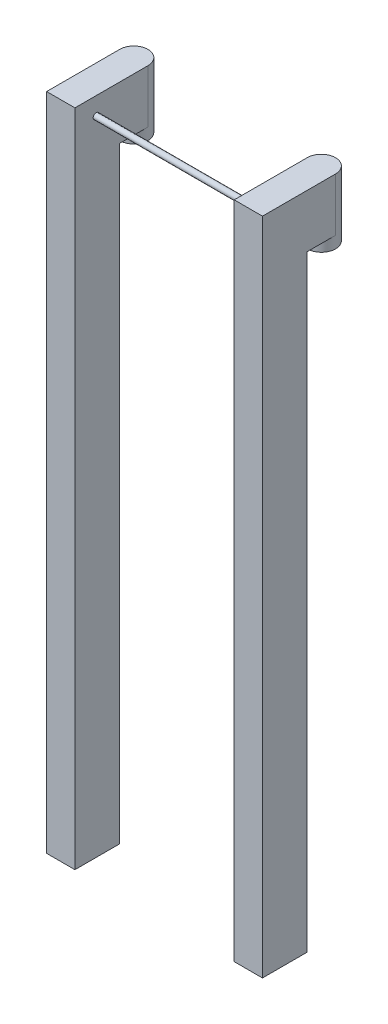
ISO-10303-21;
HEADER;
FILE_DESCRIPTION(('STEP AP214'),'2;1');
FILE_NAME('part.step','',(''),(''),'','','');
FILE_SCHEMA(('AUTOMOTIVE_DESIGN { 1 0 10303 214 1 1 1 1 }'));
ENDSEC;
DATA;
#1=APPLICATION_CONTEXT('core data for automotive mechanical design processes');
#2=APPLICATION_PROTOCOL_DEFINITION('international standard','automotive_design',2000,#1);
#3=PRODUCT_CONTEXT('',#1,'mechanical');
#4=PRODUCT('Part','Part','',(#3));
#5=PRODUCT_RELATED_PRODUCT_CATEGORY('part','',(#4));
#6=PRODUCT_DEFINITION_FORMATION('','',#4);
#7=PRODUCT_DEFINITION_CONTEXT('part definition',#1,'design');
#8=PRODUCT_DEFINITION('design','',#6,#7);
#9=PRODUCT_DEFINITION_SHAPE('','',#8);
#10=(LENGTH_UNIT() NAMED_UNIT(*) SI_UNIT(.MILLI.,.METRE.));
#11=(NAMED_UNIT(*) PLANE_ANGLE_UNIT() SI_UNIT($,.RADIAN.));
#12=(NAMED_UNIT(*) SI_UNIT($,.STERADIAN.) SOLID_ANGLE_UNIT());
#13=UNCERTAINTY_MEASURE_WITH_UNIT(LENGTH_MEASURE(1.E-05),#10,'distance_accuracy_value','');
#14=(GEOMETRIC_REPRESENTATION_CONTEXT(3) GLOBAL_UNCERTAINTY_ASSIGNED_CONTEXT((#13)) GLOBAL_UNIT_ASSIGNED_CONTEXT((#10,
#11,#12)) REPRESENTATION_CONTEXT('',''));
#15=CARTESIAN_POINT('',(0.,0.,0.));
#16=DIRECTION('',(0.,0.,1.));
#17=DIRECTION('',(1.,0.,0.));
#18=AXIS2_PLACEMENT_3D('',#15,#16,#17);
#19=CARTESIAN_POINT('',(-338.,275.5,310.));
#20=DIRECTION('',(-1.,0.,0.));
#21=DIRECTION('',(0.,0.,1.));
#22=AXIS2_PLACEMENT_3D('',#19,#20,#21);
#23=PLANE('',#22);
#24=DIRECTION('',(0.,1.,0.));
#25=VECTOR('',#24,1.);
#26=CARTESIAN_POINT('',(-338.,-2524.5,120.));
#27=LINE('',#26,#25);
#28=CARTESIAN_POINT('',(-338.,-2524.5,120.));
#29=VERTEX_POINT('',#28);
#30=CARTESIAN_POINT('',(-338.,49.9999999999999,120.));
#31=VERTEX_POINT('',#30);
#32=EDGE_CURVE('E268',#29,#31,#27,.T.);
#33=ORIENTED_EDGE('',*,*,#32,.T.);
#34=DIRECTION('',(0.,0.,-1.));
#35=VECTOR('',#34,1.);
#36=CARTESIAN_POINT('',(-338.,50.,310.));
#37=LINE('',#36,#35);
#38=CARTESIAN_POINT('',(-338.,50.,0.));
#39=VERTEX_POINT('',#38);
#40=EDGE_CURVE('E55',#31,#39,#37,.T.);
#41=ORIENTED_EDGE('',*,*,#40,.T.);
#42=DIRECTION('',(0.,1.,0.));
#43=VECTOR('',#42,1.);
#44=CARTESIAN_POINT('',(-338.,275.5,0.));
#45=LINE('',#44,#43);
#46=CARTESIAN_POINT('',(-338.,275.5,0.));
#47=VERTEX_POINT('',#46);
#48=EDGE_CURVE('E165',#39,#47,#45,.T.);
#49=ORIENTED_EDGE('',*,*,#48,.T.);
#50=DIRECTION('',(0.,0.,-1.));
#51=VECTOR('',#50,1.);
#52=CARTESIAN_POINT('',(-338.,275.5,310.));
#53=LINE('',#52,#51);
#54=CARTESIAN_POINT('',(-338.,275.5,310.));
#55=VERTEX_POINT('',#54);
#56=EDGE_CURVE('E156',#55,#47,#53,.T.);
#57=ORIENTED_EDGE('',*,*,#56,.F.);
#58=DIRECTION('',(0.,1.,0.));
#59=VECTOR('',#58,1.);
#60=CARTESIAN_POINT('',(-338.,275.5,310.));
#61=LINE('',#60,#59);
#62=CARTESIAN_POINT('',(-338.,-2524.5,310.));
#63=VERTEX_POINT('',#62);
#64=EDGE_CURVE('E158',#63,#55,#61,.T.);
#65=ORIENTED_EDGE('',*,*,#64,.F.);
#66=DIRECTION('',(0.,0.,1.));
#67=VECTOR('',#66,1.);
#68=CARTESIAN_POINT('',(-338.,-2524.5,310.));
#69=LINE('',#68,#67);
#70=EDGE_CURVE('E271',#29,#63,#69,.T.);
#71=ORIENTED_EDGE('',*,*,#70,.F.);
#72=EDGE_LOOP('',(#33,#41,#49,#57,#65,#71));
#73=FACE_BOUND('',#72,.T.);
#74=CARTESIAN_POINT('',(-338.,200.5,220.));
#75=DIRECTION('',(-1.,0.,0.));
#76=DIRECTION('',(0.,0.,1.));
#77=AXIS2_PLACEMENT_3D('',#74,#75,#76);
#78=CIRCLE('',#77,12.5);
#79=CARTESIAN_POINT('',(-338.,200.5,232.5));
#80=VERTEX_POINT('',#79);
#81=EDGE_CURVE('E330',#80,#80,#78,.T.);
#82=ORIENTED_EDGE('',*,*,#81,.T.);
#83=EDGE_LOOP('',(#82));
#84=FACE_BOUND('',#83,.T.);
#85=ADVANCED_FACE('F33',(#73,#84),#23,.F.);
#86=CARTESIAN_POINT('',(-458.,50.,310.));
#87=DIRECTION('',(0.,1.,0.));
#88=DIRECTION('',(-1.,0.,0.));
#89=AXIS2_PLACEMENT_3D('',#86,#87,#88);
#90=PLANE('',#89);
#91=DIRECTION('',(1.,0.,0.));
#92=VECTOR('',#91,1.);
#93=CARTESIAN_POINT('',(-338.,49.9999999999999,120.));
#94=LINE('',#93,#92);
#95=CARTESIAN_POINT('',(-458.,49.9999999999999,120.));
#96=VERTEX_POINT('',#95);
#97=EDGE_CURVE('E266',#96,#31,#94,.T.);
#98=ORIENTED_EDGE('',*,*,#97,.F.);
#99=DIRECTION('',(0.,0.,-1.));
#100=VECTOR('',#99,1.);
#101=CARTESIAN_POINT('',(-458.,50.,310.));
#102=LINE('',#101,#100);
#103=CARTESIAN_POINT('',(-458.,50.,0.));
#104=VERTEX_POINT('',#103);
#105=EDGE_CURVE('E47',#96,#104,#102,.T.);
#106=ORIENTED_EDGE('',*,*,#105,.T.);
#107=CARTESIAN_POINT('',(-398.,50.,0.));
#108=DIRECTION('',(0.,1.,0.));
#109=DIRECTION('',(-1.,0.,0.));
#110=AXIS2_PLACEMENT_3D('',#107,#108,#109);
#111=CIRCLE('',#110,60.);
#112=EDGE_CURVE('E11',#104,#39,#111,.T.);
#113=ORIENTED_EDGE('',*,*,#112,.T.);
#114=ORIENTED_EDGE('',*,*,#40,.F.);
#115=EDGE_LOOP('',(#98,#106,#113,#114));
#116=FACE_BOUND('',#115,.T.);
#117=ADVANCED_FACE('F202',(#116),#90,.F.);
#118=CARTESIAN_POINT('',(-398.,50.,0.));
#119=DIRECTION('',(0.,-1.,0.));
#120=DIRECTION('',(0.,0.,-1.));
#121=AXIS2_PLACEMENT_3D('',#118,#119,#120);
#122=CYLINDRICAL_SURFACE('',#121,60.);
#123=CARTESIAN_POINT('',(-398.,0.,0.));
#124=DIRECTION('',(0.,1.,0.));
#125=DIRECTION('',(0.,0.,1.));
#126=AXIS2_PLACEMENT_3D('',#123,#124,#125);
#127=CIRCLE('',#126,60.);
#128=CARTESIAN_POINT('',(-398.,0.,60.));
#129=VERTEX_POINT('',#128);
#130=EDGE_CURVE('E41',#129,#129,#127,.T.);
#131=ORIENTED_EDGE('',*,*,#130,.T.);
#132=EDGE_LOOP('',(#131));
#133=FACE_BOUND('',#132,.T.);
#134=DIRECTION('',(0.,-1.,0.));
#135=VECTOR('',#134,1.);
#136=CARTESIAN_POINT('',(-458.,275.5,0.));
#137=LINE('',#136,#135);
#138=CARTESIAN_POINT('',(-458.,275.5,0.));
#139=VERTEX_POINT('',#138);
#140=EDGE_CURVE('E162',#139,#104,#137,.T.);
#141=ORIENTED_EDGE('',*,*,#140,.F.);
#142=CARTESIAN_POINT('',(-398.,275.5,0.));
#143=DIRECTION('',(0.,1.,0.));
#144=DIRECTION('',(0.,0.,1.));
#145=AXIS2_PLACEMENT_3D('',#142,#143,#144);
#146=CIRCLE('',#145,60.);
#147=EDGE_CURVE('E172',#47,#139,#146,.T.);
#148=ORIENTED_EDGE('',*,*,#147,.F.);
#149=ORIENTED_EDGE('',*,*,#48,.F.);
#150=ORIENTED_EDGE('',*,*,#112,.F.);
#151=EDGE_LOOP('',(#141,#148,#149,#150));
#152=FACE_BOUND('',#151,.T.);
#153=ADVANCED_FACE('F35',(#133,#152),#122,.T.);
#154=CARTESIAN_POINT('',(-398.,0.,0.));
#155=DIRECTION('',(0.,1.,0.));
#156=DIRECTION('',(0.,0.,1.));
#157=AXIS2_PLACEMENT_3D('',#154,#155,#156);
#158=PLANE('',#157);
#159=ORIENTED_EDGE('',*,*,#130,.F.);
#160=EDGE_LOOP('',(#159));
#161=FACE_BOUND('',#160,.T.);
#162=CARTESIAN_POINT('',(-398.,0.,0.));
#163=DIRECTION('',(0.,1.,0.));
#164=DIRECTION('',(0.,0.,1.));
#165=AXIS2_PLACEMENT_3D('',#162,#163,#164);
#166=CIRCLE('',#165,32.528667590807);
#167=CARTESIAN_POINT('',(-398.,0.,32.528667590807));
#168=VERTEX_POINT('',#167);
#169=EDGE_CURVE('E178',#168,#168,#166,.T.);
#170=ORIENTED_EDGE('',*,*,#169,.T.);
#171=EDGE_LOOP('',(#170));
#172=FACE_BOUND('',#171,.T.);
#173=ADVANCED_FACE('F185',(#161,#172),#158,.F.);
#174=CARTESIAN_POINT('',(-398.,50.,0.));
#175=DIRECTION('',(0.,-1.,0.));
#176=DIRECTION('',(0.,0.,-1.));
#177=AXIS2_PLACEMENT_3D('',#174,#175,#176);
#178=CYLINDRICAL_SURFACE('',#177,32.528667590807);
#179=CARTESIAN_POINT('',(-398.,50.,0.));
#180=DIRECTION('',(0.,1.,0.));
#181=DIRECTION('',(0.,0.,1.));
#182=AXIS2_PLACEMENT_3D('',#179,#180,#181);
#183=CIRCLE('',#182,32.528667590807);
#184=CARTESIAN_POINT('',(-398.,50.,32.528667590807));
#185=VERTEX_POINT('',#184);
#186=EDGE_CURVE('E175',#185,#185,#183,.T.);
#187=ORIENTED_EDGE('',*,*,#186,.T.);
#188=EDGE_LOOP('',(#187));
#189=FACE_BOUND('',#188,.T.);
#190=ORIENTED_EDGE('',*,*,#169,.F.);
#191=EDGE_LOOP('',(#190));
#192=FACE_BOUND('',#191,.T.);
#193=ADVANCED_FACE('F188',(#189,#192),#178,.F.);
#194=CARTESIAN_POINT('',(-398.,50.,0.));
#195=DIRECTION('',(0.,1.,0.));
#196=DIRECTION('',(0.,0.,1.));
#197=AXIS2_PLACEMENT_3D('',#194,#195,#196);
#198=PLANE('',#197);
#199=ORIENTED_EDGE('',*,*,#186,.F.);
#200=EDGE_LOOP('',(#199));
#201=FACE_BOUND('',#200,.T.);
#202=ADVANCED_FACE('F192',(#201),#198,.F.);
#203=CARTESIAN_POINT('',(-398.,275.5,0.));
#204=DIRECTION('',(0.,1.,0.));
#205=DIRECTION('',(0.,0.,1.));
#206=AXIS2_PLACEMENT_3D('',#203,#204,#205);
#207=PLANE('',#206);
#208=DIRECTION('',(-1.,0.,0.));
#209=VECTOR('',#208,1.);
#210=CARTESIAN_POINT('',(-458.,275.5,310.));
#211=LINE('',#210,#209);
#212=CARTESIAN_POINT('',(-458.,275.5,310.));
#213=VERTEX_POINT('',#212);
#214=EDGE_CURVE('E153',#55,#213,#211,.T.);
#215=ORIENTED_EDGE('',*,*,#214,.F.);
#216=ORIENTED_EDGE('',*,*,#56,.T.);
#217=ORIENTED_EDGE('',*,*,#147,.T.);
#218=DIRECTION('',(0.,0.,-1.));
#219=VECTOR('',#218,1.);
#220=CARTESIAN_POINT('',(-458.,275.5,310.));
#221=LINE('',#220,#219);
#222=EDGE_CURVE('E152',#213,#139,#221,.T.);
#223=ORIENTED_EDGE('',*,*,#222,.F.);
#224=EDGE_LOOP('',(#215,#216,#217,#223));
#225=FACE_BOUND('',#224,.T.);
#226=ADVANCED_FACE('F198',(#225),#207,.T.);
#227=CARTESIAN_POINT('',(-458.,275.5,310.));
#228=DIRECTION('',(1.,0.,0.));
#229=DIRECTION('',(0.,0.,-1.));
#230=AXIS2_PLACEMENT_3D('',#227,#228,#229);
#231=PLANE('',#230);
#232=ORIENTED_EDGE('',*,*,#140,.T.);
#233=ORIENTED_EDGE('',*,*,#105,.F.);
#234=DIRECTION('',(0.,1.,0.));
#235=VECTOR('',#234,1.);
#236=CARTESIAN_POINT('',(-458.,-2524.5,120.));
#237=LINE('',#236,#235);
#238=CARTESIAN_POINT('',(-458.,-2524.5,120.));
#239=VERTEX_POINT('',#238);
#240=EDGE_CURVE('E166',#239,#96,#237,.T.);
#241=ORIENTED_EDGE('',*,*,#240,.F.);
#242=DIRECTION('',(0.,0.,-1.));
#243=VECTOR('',#242,1.);
#244=CARTESIAN_POINT('',(-458.,-2524.5,310.));
#245=LINE('',#244,#243);
#246=CARTESIAN_POINT('',(-458.,-2524.5,310.));
#247=VERTEX_POINT('',#246);
#248=EDGE_CURVE('E288',#247,#239,#245,.T.);
#249=ORIENTED_EDGE('',*,*,#248,.F.);
#250=DIRECTION('',(0.,-1.,0.));
#251=VECTOR('',#250,1.);
#252=CARTESIAN_POINT('',(-458.,275.5,310.));
#253=LINE('',#252,#251);
#254=EDGE_CURVE('E167',#213,#247,#253,.T.);
#255=ORIENTED_EDGE('',*,*,#254,.F.);
#256=ORIENTED_EDGE('',*,*,#222,.T.);
#257=EDGE_LOOP('',(#232,#233,#241,#249,#255,#256));
#258=FACE_BOUND('',#257,.T.);
#259=ADVANCED_FACE('F215',(#258),#231,.F.);
#260=CARTESIAN_POINT('',(0.,0.,310.));
#261=DIRECTION('',(0.,0.,1.));
#262=DIRECTION('',(1.,0.,0.));
#263=AXIS2_PLACEMENT_3D('',#260,#261,#262);
#264=PLANE('',#263);
#265=ORIENTED_EDGE('',*,*,#64,.T.);
#266=ORIENTED_EDGE('',*,*,#214,.T.);
#267=ORIENTED_EDGE('',*,*,#254,.T.);
#268=DIRECTION('',(-1.,0.,0.));
#269=VECTOR('',#268,1.);
#270=CARTESIAN_POINT('',(-338.,-2524.5,310.));
#271=LINE('',#270,#269);
#272=EDGE_CURVE('E284',#63,#247,#271,.T.);
#273=ORIENTED_EDGE('',*,*,#272,.F.);
#274=EDGE_LOOP('',(#265,#266,#267,#273));
#275=FACE_BOUND('',#274,.T.);
#276=ADVANCED_FACE('F212',(#275),#264,.T.);
#277=CARTESIAN_POINT('',(-338.,-2524.5,120.));
#278=DIRECTION('',(0.,0.,1.));
#279=DIRECTION('',(1.,0.,0.));
#280=AXIS2_PLACEMENT_3D('',#277,#278,#279);
#281=PLANE('',#280);
#282=ORIENTED_EDGE('',*,*,#97,.T.);
#283=ORIENTED_EDGE('',*,*,#32,.F.);
#284=DIRECTION('',(1.,0.,0.));
#285=VECTOR('',#284,1.);
#286=CARTESIAN_POINT('',(-338.,-2524.5,120.));
#287=LINE('',#286,#285);
#288=EDGE_CURVE('E275',#239,#29,#287,.T.);
#289=ORIENTED_EDGE('',*,*,#288,.F.);
#290=ORIENTED_EDGE('',*,*,#240,.T.);
#291=EDGE_LOOP('',(#282,#283,#289,#290));
#292=FACE_BOUND('',#291,.T.);
#293=ADVANCED_FACE('F257',(#292),#281,.F.);
#294=CARTESIAN_POINT('',(2.91953961006897E-13,-2524.5,0.));
#295=DIRECTION('',(0.,1.,0.));
#296=DIRECTION('',(-1.,0.,0.));
#297=AXIS2_PLACEMENT_3D('',#294,#295,#296);
#298=PLANE('',#297);
#299=ORIENTED_EDGE('',*,*,#70,.T.);
#300=ORIENTED_EDGE('',*,*,#272,.T.);
#301=ORIENTED_EDGE('',*,*,#248,.T.);
#302=ORIENTED_EDGE('',*,*,#288,.T.);
#303=EDGE_LOOP('',(#299,#300,#301,#302));
#304=FACE_BOUND('',#303,.T.);
#305=ADVANCED_FACE('F255',(#304),#298,.F.);
#306=CARTESIAN_POINT('',(-632.873277866951,200.5,220.));
#307=DIRECTION('',(1.,0.,0.));
#308=DIRECTION('',(0.,0.,-1.));
#309=AXIS2_PLACEMENT_3D('',#306,#307,#308);
#310=CYLINDRICAL_SURFACE('',#309,12.5);
#311=CARTESIAN_POINT('',(338.,200.5,220.));
#312=DIRECTION('',(-1.,0.,0.));
#313=DIRECTION('',(0.,0.,1.));
#314=AXIS2_PLACEMENT_3D('',#311,#312,#313);
#315=CIRCLE('',#314,12.5);
#316=CARTESIAN_POINT('',(338.,200.5,232.5));
#317=VERTEX_POINT('',#316);
#318=EDGE_CURVE('E323',#317,#317,#315,.T.);
#319=ORIENTED_EDGE('',*,*,#318,.T.);
#320=EDGE_LOOP('',(#319));
#321=FACE_BOUND('',#320,.T.);
#322=ORIENTED_EDGE('',*,*,#81,.F.);
#323=EDGE_LOOP('',(#322));
#324=FACE_BOUND('',#323,.T.);
#325=ADVANCED_FACE('F241',(#321,#324),#310,.T.);
#326=CARTESIAN_POINT('',(398.,50.,0.));
#327=DIRECTION('',(0.,1.,0.));
#328=DIRECTION('',(0.,0.,1.));
#329=AXIS2_PLACEMENT_3D('',#326,#327,#328);
#330=PLANE('',#329);
#331=CARTESIAN_POINT('',(398.,50.,0.));
#332=DIRECTION('',(0.,1.,0.));
#333=DIRECTION('',(0.,0.,1.));
#334=AXIS2_PLACEMENT_3D('',#331,#332,#333);
#335=CIRCLE('',#334,31.6967465346869);
#336=CARTESIAN_POINT('',(398.,50.,31.6967465346869));
#337=VERTEX_POINT('',#336);
#338=EDGE_CURVE('E300',#337,#337,#335,.T.);
#339=ORIENTED_EDGE('',*,*,#338,.F.);
#340=EDGE_LOOP('',(#339));
#341=FACE_BOUND('',#340,.T.);
#342=ADVANCED_FACE('F237',(#341),#330,.F.);
#343=CARTESIAN_POINT('',(398.,50.,0.));
#344=DIRECTION('',(0.,-1.,0.));
#345=DIRECTION('',(0.,0.,-1.));
#346=AXIS2_PLACEMENT_3D('',#343,#344,#345);
#347=CYLINDRICAL_SURFACE('',#346,31.6967465346869);
#348=ORIENTED_EDGE('',*,*,#338,.T.);
#349=EDGE_LOOP('',(#348));
#350=FACE_BOUND('',#349,.T.);
#351=CARTESIAN_POINT('',(398.,0.,0.));
#352=DIRECTION('',(0.,1.,0.));
#353=DIRECTION('',(0.,0.,1.));
#354=AXIS2_PLACEMENT_3D('',#351,#352,#353);
#355=CIRCLE('',#354,31.6967465346869);
#356=CARTESIAN_POINT('',(398.,0.,31.6967465346869));
#357=VERTEX_POINT('',#356);
#358=EDGE_CURVE('E297',#357,#357,#355,.T.);
#359=ORIENTED_EDGE('',*,*,#358,.F.);
#360=EDGE_LOOP('',(#359));
#361=FACE_BOUND('',#360,.T.);
#362=ADVANCED_FACE('F240',(#350,#361),#347,.F.);
#363=CARTESIAN_POINT('',(398.,0.,0.));
#364=DIRECTION('',(0.,1.,0.));
#365=DIRECTION('',(0.,0.,1.));
#366=AXIS2_PLACEMENT_3D('',#363,#364,#365);
#367=PLANE('',#366);
#368=CARTESIAN_POINT('',(398.,0.,0.));
#369=DIRECTION('',(0.,1.,0.));
#370=DIRECTION('',(0.,0.,1.));
#371=AXIS2_PLACEMENT_3D('',#368,#369,#370);
#372=CIRCLE('',#371,60.);
#373=CARTESIAN_POINT('',(398.,0.,60.));
#374=VERTEX_POINT('',#373);
#375=EDGE_CURVE('E294',#374,#374,#372,.T.);
#376=ORIENTED_EDGE('',*,*,#375,.F.);
#377=EDGE_LOOP('',(#376));
#378=FACE_BOUND('',#377,.T.);
#379=ORIENTED_EDGE('',*,*,#358,.T.);
#380=EDGE_LOOP('',(#379));
#381=FACE_BOUND('',#380,.T.);
#382=ADVANCED_FACE('F245',(#378,#381),#367,.F.);
#383=CARTESIAN_POINT('',(458.,275.5,310.));
#384=DIRECTION('',(-1.,0.,0.));
#385=DIRECTION('',(0.,0.,1.));
#386=AXIS2_PLACEMENT_3D('',#383,#384,#385);
#387=PLANE('',#386);
#388=DIRECTION('',(0.,1.,0.));
#389=VECTOR('',#388,1.);
#390=CARTESIAN_POINT('',(458.,275.5,0.));
#391=LINE('',#390,#389);
#392=CARTESIAN_POINT('',(458.,50.,0.));
#393=VERTEX_POINT('',#392);
#394=CARTESIAN_POINT('',(458.,275.5,0.));
#395=VERTEX_POINT('',#394);
#396=EDGE_CURVE('E148',#393,#395,#391,.T.);
#397=ORIENTED_EDGE('',*,*,#396,.T.);
#398=DIRECTION('',(0.,0.,-1.));
#399=VECTOR('',#398,1.);
#400=CARTESIAN_POINT('',(458.,275.5,310.));
#401=LINE('',#400,#399);
#402=CARTESIAN_POINT('',(458.,275.5,310.));
#403=VERTEX_POINT('',#402);
#404=EDGE_CURVE('E135',#403,#395,#401,.T.);
#405=ORIENTED_EDGE('',*,*,#404,.F.);
#406=DIRECTION('',(0.,1.,0.));
#407=VECTOR('',#406,1.);
#408=CARTESIAN_POINT('',(458.,275.5,310.));
#409=LINE('',#408,#407);
#410=CARTESIAN_POINT('',(458.,-2524.5,310.));
#411=VERTEX_POINT('',#410);
#412=EDGE_CURVE('E136',#411,#403,#409,.T.);
#413=ORIENTED_EDGE('',*,*,#412,.F.);
#414=DIRECTION('',(0.,0.,1.));
#415=VECTOR('',#414,1.);
#416=CARTESIAN_POINT('',(458.,-2524.5,310.));
#417=LINE('',#416,#415);
#418=CARTESIAN_POINT('',(458.,-2524.5,120.));
#419=VERTEX_POINT('',#418);
#420=EDGE_CURVE('E322',#419,#411,#417,.T.);
#421=ORIENTED_EDGE('',*,*,#420,.F.);
#422=DIRECTION('',(0.,1.,0.));
#423=VECTOR('',#422,1.);
#424=CARTESIAN_POINT('',(458.,-2524.5,120.));
#425=LINE('',#424,#423);
#426=CARTESIAN_POINT('',(458.,50.,120.));
#427=VERTEX_POINT('',#426);
#428=EDGE_CURVE('E316',#419,#427,#425,.T.);
#429=ORIENTED_EDGE('',*,*,#428,.T.);
#430=DIRECTION('',(0.,0.,-1.));
#431=VECTOR('',#430,1.);
#432=CARTESIAN_POINT('',(458.,50.,310.));
#433=LINE('',#432,#431);
#434=EDGE_CURVE('E306',#427,#393,#433,.T.);
#435=ORIENTED_EDGE('',*,*,#434,.T.);
#436=EDGE_LOOP('',(#397,#405,#413,#421,#429,#435));
#437=FACE_BOUND('',#436,.T.);
#438=ADVANCED_FACE('F249',(#437),#387,.F.);
#439=CARTESIAN_POINT('',(398.,50.,0.));
#440=DIRECTION('',(0.,-1.,0.));
#441=DIRECTION('',(0.,0.,-1.));
#442=AXIS2_PLACEMENT_3D('',#439,#440,#441);
#443=CYLINDRICAL_SURFACE('',#442,60.);
#444=ORIENTED_EDGE('',*,*,#375,.T.);
#445=EDGE_LOOP('',(#444));
#446=FACE_BOUND('',#445,.T.);
#447=DIRECTION('',(0.,-1.,0.));
#448=VECTOR('',#447,1.);
#449=CARTESIAN_POINT('',(338.,275.5,0.));
#450=LINE('',#449,#448);
#451=CARTESIAN_POINT('',(338.,275.5,0.));
#452=VERTEX_POINT('',#451);
#453=CARTESIAN_POINT('',(338.,50.,0.));
#454=VERTEX_POINT('',#453);
#455=EDGE_CURVE('E311',#452,#454,#450,.T.);
#456=ORIENTED_EDGE('',*,*,#455,.F.);
#457=CARTESIAN_POINT('',(398.,275.5,0.));
#458=DIRECTION('',(0.,1.,0.));
#459=DIRECTION('',(0.,0.,1.));
#460=AXIS2_PLACEMENT_3D('',#457,#458,#459);
#461=CIRCLE('',#460,60.);
#462=EDGE_CURVE('E131',#395,#452,#461,.T.);
#463=ORIENTED_EDGE('',*,*,#462,.F.);
#464=ORIENTED_EDGE('',*,*,#396,.F.);
#465=CARTESIAN_POINT('',(398.,50.,0.));
#466=DIRECTION('',(0.,1.,0.));
#467=DIRECTION('',(-1.,0.,0.));
#468=AXIS2_PLACEMENT_3D('',#465,#466,#467);
#469=CIRCLE('',#468,60.);
#470=EDGE_CURVE('E272',#454,#393,#469,.T.);
#471=ORIENTED_EDGE('',*,*,#470,.F.);
#472=EDGE_LOOP('',(#456,#463,#464,#471));
#473=FACE_BOUND('',#472,.T.);
#474=ADVANCED_FACE('F251',(#446,#473),#443,.T.);
#475=CARTESIAN_POINT('',(338.,50.,310.));
#476=DIRECTION('',(0.,1.,0.));
#477=DIRECTION('',(-1.,0.,0.));
#478=AXIS2_PLACEMENT_3D('',#475,#476,#477);
#479=PLANE('',#478);
#480=DIRECTION('',(1.,0.,0.));
#481=VECTOR('',#480,1.);
#482=CARTESIAN_POINT('',(458.,50.,120.));
#483=LINE('',#482,#481);
#484=CARTESIAN_POINT('',(338.,49.9999999999999,120.));
#485=VERTEX_POINT('',#484);
#486=EDGE_CURVE('E320',#485,#427,#483,.T.);
#487=ORIENTED_EDGE('',*,*,#486,.F.);
#488=DIRECTION('',(0.,0.,-1.));
#489=VECTOR('',#488,1.);
#490=CARTESIAN_POINT('',(338.,50.,310.));
#491=LINE('',#490,#489);
#492=EDGE_CURVE('E304',#485,#454,#491,.T.);
#493=ORIENTED_EDGE('',*,*,#492,.T.);
#494=ORIENTED_EDGE('',*,*,#470,.T.);
#495=ORIENTED_EDGE('',*,*,#434,.F.);
#496=EDGE_LOOP('',(#487,#493,#494,#495));
#497=FACE_BOUND('',#496,.T.);
#498=ADVANCED_FACE('F235',(#497),#479,.F.);
#499=CARTESIAN_POINT('',(2.91953961006897E-13,-2524.5,0.));
#500=DIRECTION('',(0.,1.,0.));
#501=DIRECTION('',(-1.,0.,0.));
#502=AXIS2_PLACEMENT_3D('',#499,#500,#501);
#503=PLANE('',#502);
#504=ORIENTED_EDGE('',*,*,#420,.T.);
#505=DIRECTION('',(-1.,0.,0.));
#506=VECTOR('',#505,1.);
#507=CARTESIAN_POINT('',(458.,-2524.5,310.));
#508=LINE('',#507,#506);
#509=CARTESIAN_POINT('',(338.,-2524.5,310.));
#510=VERTEX_POINT('',#509);
#511=EDGE_CURVE('E326',#411,#510,#508,.T.);
#512=ORIENTED_EDGE('',*,*,#511,.T.);
#513=DIRECTION('',(0.,0.,-1.));
#514=VECTOR('',#513,1.);
#515=CARTESIAN_POINT('',(338.,-2524.5,310.));
#516=LINE('',#515,#514);
#517=CARTESIAN_POINT('',(338.,-2524.5,120.));
#518=VERTEX_POINT('',#517);
#519=EDGE_CURVE('E144',#510,#518,#516,.T.);
#520=ORIENTED_EDGE('',*,*,#519,.T.);
#521=DIRECTION('',(1.,0.,0.));
#522=VECTOR('',#521,1.);
#523=CARTESIAN_POINT('',(458.,-2524.5,120.));
#524=LINE('',#523,#522);
#525=EDGE_CURVE('E319',#518,#419,#524,.T.);
#526=ORIENTED_EDGE('',*,*,#525,.T.);
#527=EDGE_LOOP('',(#504,#512,#520,#526));
#528=FACE_BOUND('',#527,.T.);
#529=ADVANCED_FACE('F341',(#528),#503,.F.);
#530=CARTESIAN_POINT('',(458.,-2524.5,120.));
#531=DIRECTION('',(0.,0.,1.));
#532=DIRECTION('',(1.,0.,0.));
#533=AXIS2_PLACEMENT_3D('',#530,#531,#532);
#534=PLANE('',#533);
#535=ORIENTED_EDGE('',*,*,#486,.T.);
#536=ORIENTED_EDGE('',*,*,#428,.F.);
#537=ORIENTED_EDGE('',*,*,#525,.F.);
#538=DIRECTION('',(0.,1.,0.));
#539=VECTOR('',#538,1.);
#540=CARTESIAN_POINT('',(338.,-2524.5,120.));
#541=LINE('',#540,#539);
#542=EDGE_CURVE('E313',#518,#485,#541,.T.);
#543=ORIENTED_EDGE('',*,*,#542,.T.);
#544=EDGE_LOOP('',(#535,#536,#537,#543));
#545=FACE_BOUND('',#544,.T.);
#546=ADVANCED_FACE('F232',(#545),#534,.F.);
#547=CARTESIAN_POINT('',(338.,275.5,310.));
#548=VERTEX_POINT('',#547);
#549=EDGE_CURVE('E129',#403,#548,#211,.T.);
#550=ORIENTED_EDGE('',*,*,#549,.T.);
#551=DIRECTION('',(0.,-1.,0.));
#552=VECTOR('',#551,1.);
#553=CARTESIAN_POINT('',(338.,275.5,310.));
#554=LINE('',#553,#552);
#555=EDGE_CURVE('E139',#548,#510,#554,.T.);
#556=ORIENTED_EDGE('',*,*,#555,.T.);
#557=ORIENTED_EDGE('',*,*,#511,.F.);
#558=ORIENTED_EDGE('',*,*,#412,.T.);
#559=EDGE_LOOP('',(#550,#556,#557,#558));
#560=FACE_BOUND('',#559,.T.);
#561=ADVANCED_FACE('F150',(#560),#264,.T.);
#562=CARTESIAN_POINT('',(338.,275.5,310.));
#563=DIRECTION('',(1.,0.,0.));
#564=DIRECTION('',(0.,0.,-1.));
#565=AXIS2_PLACEMENT_3D('',#562,#563,#564);
#566=PLANE('',#565);
#567=ORIENTED_EDGE('',*,*,#492,.F.);
#568=ORIENTED_EDGE('',*,*,#542,.F.);
#569=ORIENTED_EDGE('',*,*,#519,.F.);
#570=ORIENTED_EDGE('',*,*,#555,.F.);
#571=DIRECTION('',(0.,0.,-1.));
#572=VECTOR('',#571,1.);
#573=CARTESIAN_POINT('',(338.,275.5,310.));
#574=LINE('',#573,#572);
#575=EDGE_CURVE('E124',#548,#452,#574,.T.);
#576=ORIENTED_EDGE('',*,*,#575,.T.);
#577=ORIENTED_EDGE('',*,*,#455,.T.);
#578=EDGE_LOOP('',(#567,#568,#569,#570,#576,#577));
#579=FACE_BOUND('',#578,.T.);
#580=ORIENTED_EDGE('',*,*,#318,.F.);
#581=EDGE_LOOP('',(#580));
#582=FACE_BOUND('',#581,.T.);
#583=ADVANCED_FACE('F141',(#579,#582),#566,.F.);
#584=ORIENTED_EDGE('',*,*,#575,.F.);
#585=ORIENTED_EDGE('',*,*,#549,.F.);
#586=ORIENTED_EDGE('',*,*,#404,.T.);
#587=ORIENTED_EDGE('',*,*,#462,.T.);
#588=EDGE_LOOP('',(#584,#585,#586,#587));
#589=FACE_BOUND('',#588,.T.);
#590=ADVANCED_FACE('F126',(#589),#207,.T.);
#591=CLOSED_SHELL('',(#85,#117,#153,#173,#193,#202,#226,#259,#276,#293,#305,#325,#342,#362,#382,
#438,#474,#498,#529,#546,#561,#583,#590));
#592=MANIFOLD_SOLID_BREP('B2',#591);
#593=ADVANCED_BREP_SHAPE_REPRESENTATION('',(#18,#592),#14);
#594=SHAPE_DEFINITION_REPRESENTATION(#9,#593);
ENDSEC;
END-ISO-10303-21;
